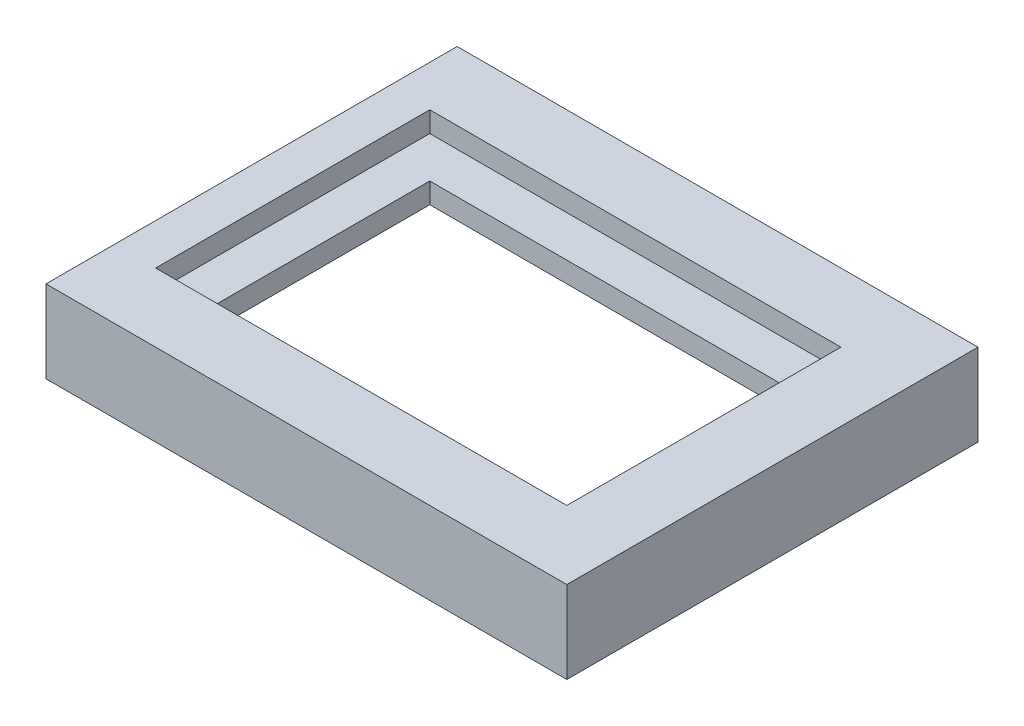
ISO-10303-21;
HEADER;
FILE_DESCRIPTION(('STEP AP214'),'2;1');
FILE_NAME('part.step','',(''),(''),'','','');
FILE_SCHEMA(('AUTOMOTIVE_DESIGN { 1 0 10303 214 1 1 1 1 }'));
ENDSEC;
DATA;
#1=APPLICATION_CONTEXT('core data for automotive mechanical design processes');
#2=APPLICATION_PROTOCOL_DEFINITION('international standard','automotive_design',2000,#1);
#3=PRODUCT_CONTEXT('',#1,'mechanical');
#4=PRODUCT('Part','Part','',(#3));
#5=PRODUCT_RELATED_PRODUCT_CATEGORY('part','',(#4));
#6=PRODUCT_DEFINITION_FORMATION('','',#4);
#7=PRODUCT_DEFINITION_CONTEXT('part definition',#1,'design');
#8=PRODUCT_DEFINITION('design','',#6,#7);
#9=PRODUCT_DEFINITION_SHAPE('','',#8);
#10=(LENGTH_UNIT() NAMED_UNIT(*) SI_UNIT(.MILLI.,.METRE.));
#11=(NAMED_UNIT(*) PLANE_ANGLE_UNIT() SI_UNIT($,.RADIAN.));
#12=(NAMED_UNIT(*) SI_UNIT($,.STERADIAN.) SOLID_ANGLE_UNIT());
#13=UNCERTAINTY_MEASURE_WITH_UNIT(LENGTH_MEASURE(1.E-05),#10,'distance_accuracy_value','');
#14=(GEOMETRIC_REPRESENTATION_CONTEXT(3) GLOBAL_UNCERTAINTY_ASSIGNED_CONTEXT((#13)) GLOBAL_UNIT_ASSIGNED_CONTEXT((#10,
#11,#12)) REPRESENTATION_CONTEXT('',''));
#15=CARTESIAN_POINT('',(0.,0.,0.));
#16=DIRECTION('',(0.,0.,1.));
#17=DIRECTION('',(1.,0.,0.));
#18=AXIS2_PLACEMENT_3D('',#15,#16,#17);
#19=CARTESIAN_POINT('',(0.,3.,0.));
#20=DIRECTION('',(0.,-1.,0.));
#21=DIRECTION('',(0.,0.,-1.));
#22=AXIS2_PLACEMENT_3D('',#19,#20,#21);
#23=PLANE('',#22);
#24=DIRECTION('',(1.,0.,0.));
#25=VECTOR('',#24,1.);
#26=CARTESIAN_POINT('',(-9.99999999999999,3.,7.5));
#27=LINE('',#26,#25);
#28=CARTESIAN_POINT('',(-9.99999999999999,3.,7.5));
#29=VERTEX_POINT('',#28);
#30=CARTESIAN_POINT('',(9.00000000000001,3.,7.5));
#31=VERTEX_POINT('',#30);
#32=EDGE_CURVE('E172',#29,#31,#27,.T.);
#33=ORIENTED_EDGE('',*,*,#32,.T.);
#34=DIRECTION('',(0.,0.,1.));
#35=VECTOR('',#34,1.);
#36=CARTESIAN_POINT('',(9.00000000000001,3.,0.));
#37=LINE('',#36,#35);
#38=CARTESIAN_POINT('',(9.00000000000001,3.,-7.5));
#39=VERTEX_POINT('',#38);
#40=EDGE_CURVE('E158',#39,#31,#37,.T.);
#41=ORIENTED_EDGE('',*,*,#40,.F.);
#42=DIRECTION('',(1.,0.,0.));
#43=VECTOR('',#42,1.);
#44=CARTESIAN_POINT('',(-9.99999999999999,3.,-7.5));
#45=LINE('',#44,#43);
#46=CARTESIAN_POINT('',(-9.99999999999999,3.,-7.5));
#47=VERTEX_POINT('',#46);
#48=EDGE_CURVE('E169',#47,#39,#45,.T.);
#49=ORIENTED_EDGE('',*,*,#48,.F.);
#50=DIRECTION('',(0.,0.,-1.));
#51=VECTOR('',#50,1.);
#52=CARTESIAN_POINT('',(-9.99999999999999,3.,7.5));
#53=LINE('',#52,#51);
#54=EDGE_CURVE('E179',#29,#47,#53,.T.);
#55=ORIENTED_EDGE('',*,*,#54,.F.);
#56=EDGE_LOOP('',(#33,#41,#49,#55));
#57=FACE_BOUND('',#56,.T.);
#58=DIRECTION('',(1.,0.,0.));
#59=VECTOR('',#58,1.);
#60=CARTESIAN_POINT('',(0.,3.,-5.));
#61=LINE('',#60,#59);
#62=CARTESIAN_POINT('',(-8.49999999999999,3.,-5.));
#63=VERTEX_POINT('',#62);
#64=CARTESIAN_POINT('',(6.5,3.,-5.));
#65=VERTEX_POINT('',#64);
#66=EDGE_CURVE('E68',#63,#65,#61,.T.);
#67=ORIENTED_EDGE('',*,*,#66,.T.);
#68=DIRECTION('',(0.,0.,-1.));
#69=VECTOR('',#68,1.);
#70=CARTESIAN_POINT('',(6.5,3.,0.));
#71=LINE('',#70,#69);
#72=CARTESIAN_POINT('',(6.5,3.,5.));
#73=VERTEX_POINT('',#72);
#74=EDGE_CURVE('E229',#73,#65,#71,.T.);
#75=ORIENTED_EDGE('',*,*,#74,.F.);
#76=DIRECTION('',(1.,0.,0.));
#77=VECTOR('',#76,1.);
#78=CARTESIAN_POINT('',(0.,3.,5.));
#79=LINE('',#78,#77);
#80=CARTESIAN_POINT('',(-8.49999999999999,3.,5.));
#81=VERTEX_POINT('',#80);
#82=EDGE_CURVE('E381',#81,#73,#79,.T.);
#83=ORIENTED_EDGE('',*,*,#82,.F.);
#84=DIRECTION('',(0.,0.,-1.));
#85=VECTOR('',#84,1.);
#86=CARTESIAN_POINT('',(-8.49999999999999,3.,0.));
#87=LINE('',#86,#85);
#88=EDGE_CURVE('E375',#81,#63,#87,.T.);
#89=ORIENTED_EDGE('',*,*,#88,.T.);
#90=EDGE_LOOP('',(#67,#75,#83,#89));
#91=FACE_BOUND('',#90,.T.);
#92=ADVANCED_FACE('F45',(#57,#91),#23,.F.);
#93=CARTESIAN_POINT('',(0.,0.,0.));
#94=DIRECTION('',(0.,-1.,0.));
#95=DIRECTION('',(0.,0.,-1.));
#96=AXIS2_PLACEMENT_3D('',#93,#94,#95);
#97=PLANE('',#96);
#98=DIRECTION('',(0.,0.,-1.));
#99=VECTOR('',#98,1.);
#100=CARTESIAN_POINT('',(9.00000000000001,0.,0.));
#101=LINE('',#100,#99);
#102=CARTESIAN_POINT('',(9.00000000000001,0.,7.5));
#103=VERTEX_POINT('',#102);
#104=CARTESIAN_POINT('',(9.00000000000001,0.,-7.5));
#105=VERTEX_POINT('',#104);
#106=EDGE_CURVE('E60',#103,#105,#101,.T.);
#107=ORIENTED_EDGE('',*,*,#106,.F.);
#108=DIRECTION('',(1.,0.,0.));
#109=VECTOR('',#108,1.);
#110=CARTESIAN_POINT('',(-9.99999999999999,0.,7.5));
#111=LINE('',#110,#109);
#112=CARTESIAN_POINT('',(-9.99999999999999,0.,7.5));
#113=VERTEX_POINT('',#112);
#114=EDGE_CURVE('E184',#113,#103,#111,.T.);
#115=ORIENTED_EDGE('',*,*,#114,.F.);
#116=DIRECTION('',(0.,0.,-1.));
#117=VECTOR('',#116,1.);
#118=CARTESIAN_POINT('',(-9.99999999999999,0.,7.5));
#119=LINE('',#118,#117);
#120=CARTESIAN_POINT('',(-9.99999999999999,0.,-7.5));
#121=VERTEX_POINT('',#120);
#122=EDGE_CURVE('E188',#113,#121,#119,.T.);
#123=ORIENTED_EDGE('',*,*,#122,.T.);
#124=DIRECTION('',(1.,0.,0.));
#125=VECTOR('',#124,1.);
#126=CARTESIAN_POINT('',(-9.99999999999999,0.,-7.5));
#127=LINE('',#126,#125);
#128=EDGE_CURVE('E192',#121,#105,#127,.T.);
#129=ORIENTED_EDGE('',*,*,#128,.T.);
#130=EDGE_LOOP('',(#107,#115,#123,#129));
#131=FACE_BOUND('',#130,.T.);
#132=DIRECTION('',(0.,0.,1.));
#133=VECTOR('',#132,1.);
#134=CARTESIAN_POINT('',(6.5,0.,0.));
#135=LINE('',#134,#133);
#136=CARTESIAN_POINT('',(6.5,0.,-5.));
#137=VERTEX_POINT('',#136);
#138=CARTESIAN_POINT('',(6.5,0.,5.));
#139=VERTEX_POINT('',#138);
#140=EDGE_CURVE('E270',#137,#139,#135,.T.);
#141=ORIENTED_EDGE('',*,*,#140,.F.);
#142=DIRECTION('',(-1.,0.,0.));
#143=VECTOR('',#142,1.);
#144=CARTESIAN_POINT('',(0.,0.,-5.));
#145=LINE('',#144,#143);
#146=CARTESIAN_POINT('',(-8.49999999999999,0.,-5.));
#147=VERTEX_POINT('',#146);
#148=EDGE_CURVE('E277',#137,#147,#145,.T.);
#149=ORIENTED_EDGE('',*,*,#148,.T.);
#150=DIRECTION('',(0.,0.,1.));
#151=VECTOR('',#150,1.);
#152=CARTESIAN_POINT('',(-8.49999999999999,0.,0.));
#153=LINE('',#152,#151);
#154=CARTESIAN_POINT('',(-8.49999999999999,0.,5.));
#155=VERTEX_POINT('',#154);
#156=EDGE_CURVE('E254',#147,#155,#153,.T.);
#157=ORIENTED_EDGE('',*,*,#156,.T.);
#158=DIRECTION('',(-1.,0.,0.));
#159=VECTOR('',#158,1.);
#160=CARTESIAN_POINT('',(0.,0.,5.));
#161=LINE('',#160,#159);
#162=EDGE_CURVE('E262',#139,#155,#161,.T.);
#163=ORIENTED_EDGE('',*,*,#162,.F.);
#164=EDGE_LOOP('',(#141,#149,#157,#163));
#165=FACE_BOUND('',#164,.T.);
#166=ADVANCED_FACE('F354',(#131,#165),#97,.T.);
#167=CARTESIAN_POINT('',(8.,0.75,-6.50000000000001));
#168=DIRECTION('',(0.,-1.,0.));
#169=DIRECTION('',(0.,0.,-1.));
#170=AXIS2_PLACEMENT_3D('',#167,#168,#169);
#171=PLANE('',#170);
#172=DIRECTION('',(0.,0.,1.));
#173=VECTOR('',#172,1.);
#174=CARTESIAN_POINT('',(-9.99999999999999,0.75,-6.50000000000001));
#175=LINE('',#174,#173);
#176=CARTESIAN_POINT('',(-9.99999999999999,0.75,-6.50000000000001));
#177=VERTEX_POINT('',#176);
#178=CARTESIAN_POINT('',(-9.99999999999999,0.75,6.49999999999999));
#179=VERTEX_POINT('',#178);
#180=EDGE_CURVE('E281',#177,#179,#175,.T.);
#181=ORIENTED_EDGE('',*,*,#180,.T.);
#182=DIRECTION('',(-1.,0.,0.));
#183=VECTOR('',#182,1.);
#184=CARTESIAN_POINT('',(8.,0.75,6.49999999999999));
#185=LINE('',#184,#183);
#186=CARTESIAN_POINT('',(8.,0.75,6.49999999999999));
#187=VERTEX_POINT('',#186);
#188=EDGE_CURVE('E297',#187,#179,#185,.T.);
#189=ORIENTED_EDGE('',*,*,#188,.F.);
#190=DIRECTION('',(0.,0.,1.));
#191=VECTOR('',#190,1.);
#192=CARTESIAN_POINT('',(8.,0.75,-6.50000000000001));
#193=LINE('',#192,#191);
#194=CARTESIAN_POINT('',(8.,0.75,-6.50000000000001));
#195=VERTEX_POINT('',#194);
#196=EDGE_CURVE('E282',#195,#187,#193,.T.);
#197=ORIENTED_EDGE('',*,*,#196,.F.);
#198=DIRECTION('',(-1.,0.,0.));
#199=VECTOR('',#198,1.);
#200=CARTESIAN_POINT('',(8.,0.75,-6.50000000000001));
#201=LINE('',#200,#199);
#202=EDGE_CURVE('E193',#195,#177,#201,.T.);
#203=ORIENTED_EDGE('',*,*,#202,.T.);
#204=EDGE_LOOP('',(#181,#189,#197,#203));
#205=FACE_BOUND('',#204,.T.);
#206=DIRECTION('',(-1.,0.,0.));
#207=VECTOR('',#206,1.);
#208=CARTESIAN_POINT('',(8.,0.75,-5.));
#209=LINE('',#208,#207);
#210=CARTESIAN_POINT('',(6.5,0.750000000000001,-5.));
#211=VERTEX_POINT('',#210);
#212=CARTESIAN_POINT('',(-8.5,0.75,-5.));
#213=VERTEX_POINT('',#212);
#214=EDGE_CURVE('E273',#211,#213,#209,.T.);
#215=ORIENTED_EDGE('',*,*,#214,.F.);
#216=DIRECTION('',(0.,0.,1.));
#217=VECTOR('',#216,1.);
#218=CARTESIAN_POINT('',(6.5,0.75,-6.50000000000001));
#219=LINE('',#218,#217);
#220=CARTESIAN_POINT('',(6.5,0.750000000000001,5.));
#221=VERTEX_POINT('',#220);
#222=EDGE_CURVE('E266',#211,#221,#219,.T.);
#223=ORIENTED_EDGE('',*,*,#222,.T.);
#224=DIRECTION('',(-1.,0.,0.));
#225=VECTOR('',#224,1.);
#226=CARTESIAN_POINT('',(8.,0.75,5.));
#227=LINE('',#226,#225);
#228=CARTESIAN_POINT('',(-8.49999999999999,0.750000000000001,5.));
#229=VERTEX_POINT('',#228);
#230=EDGE_CURVE('E258',#221,#229,#227,.T.);
#231=ORIENTED_EDGE('',*,*,#230,.T.);
#232=DIRECTION('',(0.,0.,1.));
#233=VECTOR('',#232,1.);
#234=CARTESIAN_POINT('',(-8.5,0.75,-6.50000000000001));
#235=LINE('',#234,#233);
#236=EDGE_CURVE('E237',#213,#229,#235,.T.);
#237=ORIENTED_EDGE('',*,*,#236,.F.);
#238=EDGE_LOOP('',(#215,#223,#231,#237));
#239=FACE_BOUND('',#238,.T.);
#240=ADVANCED_FACE('F338',(#205,#239),#171,.F.);
#241=CARTESIAN_POINT('',(8.,2.25,-6.50000000000001));
#242=DIRECTION('',(0.,-1.,0.));
#243=DIRECTION('',(0.,0.,-1.));
#244=AXIS2_PLACEMENT_3D('',#241,#242,#243);
#245=PLANE('',#244);
#246=DIRECTION('',(0.,0.,1.));
#247=VECTOR('',#246,1.);
#248=CARTESIAN_POINT('',(-9.99999999999999,2.25,-6.50000000000001));
#249=LINE('',#248,#247);
#250=CARTESIAN_POINT('',(-9.99999999999999,2.25,-6.50000000000001));
#251=VERTEX_POINT('',#250);
#252=CARTESIAN_POINT('',(-9.99999999999999,2.25,6.49999999999999));
#253=VERTEX_POINT('',#252);
#254=EDGE_CURVE('E304',#251,#253,#249,.T.);
#255=ORIENTED_EDGE('',*,*,#254,.F.);
#256=DIRECTION('',(-1.,0.,0.));
#257=VECTOR('',#256,1.);
#258=CARTESIAN_POINT('',(8.,2.25,-6.50000000000001));
#259=LINE('',#258,#257);
#260=CARTESIAN_POINT('',(8.,2.25,-6.50000000000001));
#261=VERTEX_POINT('',#260);
#262=EDGE_CURVE('E313',#261,#251,#259,.T.);
#263=ORIENTED_EDGE('',*,*,#262,.F.);
#264=DIRECTION('',(0.,0.,1.));
#265=VECTOR('',#264,1.);
#266=CARTESIAN_POINT('',(8.,2.25,-6.50000000000001));
#267=LINE('',#266,#265);
#268=CARTESIAN_POINT('',(8.,2.25,6.49999999999999));
#269=VERTEX_POINT('',#268);
#270=EDGE_CURVE('E291',#261,#269,#267,.T.);
#271=ORIENTED_EDGE('',*,*,#270,.T.);
#272=DIRECTION('',(-1.,0.,0.));
#273=VECTOR('',#272,1.);
#274=CARTESIAN_POINT('',(8.,2.25,6.49999999999999));
#275=LINE('',#274,#273);
#276=EDGE_CURVE('E316',#269,#253,#275,.T.);
#277=ORIENTED_EDGE('',*,*,#276,.T.);
#278=EDGE_LOOP('',(#255,#263,#271,#277));
#279=FACE_BOUND('',#278,.T.);
#280=DIRECTION('',(0.,0.,1.));
#281=VECTOR('',#280,1.);
#282=CARTESIAN_POINT('',(6.5,2.25,-6.50000000000001));
#283=LINE('',#282,#281);
#284=CARTESIAN_POINT('',(6.5,2.25,-5.));
#285=VERTEX_POINT('',#284);
#286=CARTESIAN_POINT('',(6.5,2.25,5.));
#287=VERTEX_POINT('',#286);
#288=EDGE_CURVE('E212',#285,#287,#283,.T.);
#289=ORIENTED_EDGE('',*,*,#288,.F.);
#290=DIRECTION('',(-1.,0.,0.));
#291=VECTOR('',#290,1.);
#292=CARTESIAN_POINT('',(8.,2.25,-5.));
#293=LINE('',#292,#291);
#294=CARTESIAN_POINT('',(-8.49999999999999,2.25,-5.));
#295=VERTEX_POINT('',#294);
#296=EDGE_CURVE('E54',#285,#295,#293,.T.);
#297=ORIENTED_EDGE('',*,*,#296,.T.);
#298=DIRECTION('',(0.,0.,1.));
#299=VECTOR('',#298,1.);
#300=CARTESIAN_POINT('',(-8.5,2.25,-6.50000000000001));
#301=LINE('',#300,#299);
#302=CARTESIAN_POINT('',(-8.5,2.25,5.));
#303=VERTEX_POINT('',#302);
#304=EDGE_CURVE('E202',#295,#303,#301,.T.);
#305=ORIENTED_EDGE('',*,*,#304,.T.);
#306=DIRECTION('',(-1.,0.,0.));
#307=VECTOR('',#306,1.);
#308=CARTESIAN_POINT('',(8.,2.25,5.));
#309=LINE('',#308,#307);
#310=EDGE_CURVE('E208',#287,#303,#309,.T.);
#311=ORIENTED_EDGE('',*,*,#310,.F.);
#312=EDGE_LOOP('',(#289,#297,#305,#311));
#313=FACE_BOUND('',#312,.T.);
#314=ADVANCED_FACE('F218',(#279,#313),#245,.T.);
#315=CARTESIAN_POINT('',(-9.99999999999999,3.,7.5));
#316=DIRECTION('',(-1.,0.,0.));
#317=DIRECTION('',(0.,0.,1.));
#318=AXIS2_PLACEMENT_3D('',#315,#316,#317);
#319=PLANE('',#318);
#320=ORIENTED_EDGE('',*,*,#180,.F.);
#321=DIRECTION('',(0.,1.,0.));
#322=VECTOR('',#321,1.);
#323=CARTESIAN_POINT('',(-9.99999999999999,0.75,-6.50000000000001));
#324=LINE('',#323,#322);
#325=EDGE_CURVE('E287',#177,#251,#324,.T.);
#326=ORIENTED_EDGE('',*,*,#325,.T.);
#327=ORIENTED_EDGE('',*,*,#254,.T.);
#328=DIRECTION('',(0.,1.,0.));
#329=VECTOR('',#328,1.);
#330=CARTESIAN_POINT('',(-9.99999999999999,0.75,6.49999999999999));
#331=LINE('',#330,#329);
#332=EDGE_CURVE('E300',#179,#253,#331,.T.);
#333=ORIENTED_EDGE('',*,*,#332,.F.);
#334=EDGE_LOOP('',(#320,#326,#327,#333));
#335=FACE_BOUND('',#334,.T.);
#336=ORIENTED_EDGE('',*,*,#122,.F.);
#337=DIRECTION('',(0.,-1.,0.));
#338=VECTOR('',#337,1.);
#339=CARTESIAN_POINT('',(-9.99999999999999,3.,7.5));
#340=LINE('',#339,#338);
#341=EDGE_CURVE('E199',#29,#113,#340,.T.);
#342=ORIENTED_EDGE('',*,*,#341,.F.);
#343=ORIENTED_EDGE('',*,*,#54,.T.);
#344=DIRECTION('',(0.,-1.,0.));
#345=VECTOR('',#344,1.);
#346=CARTESIAN_POINT('',(-9.99999999999999,3.,-7.5));
#347=LINE('',#346,#345);
#348=EDGE_CURVE('E177',#47,#121,#347,.T.);
#349=ORIENTED_EDGE('',*,*,#348,.T.);
#350=EDGE_LOOP('',(#336,#342,#343,#349));
#351=FACE_BOUND('',#350,.T.);
#352=ADVANCED_FACE('F47',(#335,#351),#319,.T.);
#353=CARTESIAN_POINT('',(-9.99999999999999,3.,7.5));
#354=DIRECTION('',(0.,0.,-1.));
#355=DIRECTION('',(-1.,0.,0.));
#356=AXIS2_PLACEMENT_3D('',#353,#354,#355);
#357=PLANE('',#356);
#358=ORIENTED_EDGE('',*,*,#114,.T.);
#359=DIRECTION('',(0.,1.,0.));
#360=VECTOR('',#359,1.);
#361=CARTESIAN_POINT('',(9.00000000000001,-15.,7.5));
#362=LINE('',#361,#360);
#363=EDGE_CURVE('E174',#103,#31,#362,.T.);
#364=ORIENTED_EDGE('',*,*,#363,.T.);
#365=ORIENTED_EDGE('',*,*,#32,.F.);
#366=ORIENTED_EDGE('',*,*,#341,.T.);
#367=EDGE_LOOP('',(#358,#364,#365,#366));
#368=FACE_BOUND('',#367,.T.);
#369=ADVANCED_FACE('F350',(#368),#357,.F.);
#370=CARTESIAN_POINT('',(-9.99999999999999,3.,-7.5));
#371=DIRECTION('',(0.,0.,-1.));
#372=DIRECTION('',(-1.,0.,0.));
#373=AXIS2_PLACEMENT_3D('',#370,#371,#372);
#374=PLANE('',#373);
#375=DIRECTION('',(0.,1.,0.));
#376=VECTOR('',#375,1.);
#377=CARTESIAN_POINT('',(9.00000000000001,3.,-7.5));
#378=LINE('',#377,#376);
#379=EDGE_CURVE('E11',#105,#39,#378,.T.);
#380=ORIENTED_EDGE('',*,*,#379,.F.);
#381=ORIENTED_EDGE('',*,*,#128,.F.);
#382=ORIENTED_EDGE('',*,*,#348,.F.);
#383=ORIENTED_EDGE('',*,*,#48,.T.);
#384=EDGE_LOOP('',(#380,#381,#382,#383));
#385=FACE_BOUND('',#384,.T.);
#386=ADVANCED_FACE('F176',(#385),#374,.T.);
#387=CARTESIAN_POINT('',(8.,0.75,-6.50000000000001));
#388=DIRECTION('',(0.,0.,1.));
#389=DIRECTION('',(1.,0.,0.));
#390=AXIS2_PLACEMENT_3D('',#387,#388,#389);
#391=PLANE('',#390);
#392=ORIENTED_EDGE('',*,*,#325,.F.);
#393=ORIENTED_EDGE('',*,*,#202,.F.);
#394=DIRECTION('',(0.,1.,0.));
#395=VECTOR('',#394,1.);
#396=CARTESIAN_POINT('',(8.,0.75,-6.50000000000001));
#397=LINE('',#396,#395);
#398=EDGE_CURVE('E294',#195,#261,#397,.T.);
#399=ORIENTED_EDGE('',*,*,#398,.T.);
#400=ORIENTED_EDGE('',*,*,#262,.T.);
#401=EDGE_LOOP('',(#392,#393,#399,#400));
#402=FACE_BOUND('',#401,.T.);
#403=ADVANCED_FACE('F341',(#402),#391,.T.);
#404=CARTESIAN_POINT('',(8.,0.75,6.49999999999999));
#405=DIRECTION('',(0.,0.,1.));
#406=DIRECTION('',(1.,0.,0.));
#407=AXIS2_PLACEMENT_3D('',#404,#405,#406);
#408=PLANE('',#407);
#409=ORIENTED_EDGE('',*,*,#332,.T.);
#410=ORIENTED_EDGE('',*,*,#276,.F.);
#411=DIRECTION('',(0.,1.,0.));
#412=VECTOR('',#411,1.);
#413=CARTESIAN_POINT('',(8.,0.75,6.49999999999999));
#414=LINE('',#413,#412);
#415=EDGE_CURVE('E286',#187,#269,#414,.T.);
#416=ORIENTED_EDGE('',*,*,#415,.F.);
#417=ORIENTED_EDGE('',*,*,#188,.T.);
#418=EDGE_LOOP('',(#409,#410,#416,#417));
#419=FACE_BOUND('',#418,.T.);
#420=ADVANCED_FACE('F323',(#419),#408,.F.);
#421=CARTESIAN_POINT('',(8.,0.,0.));
#422=DIRECTION('',(-1.,0.,0.));
#423=DIRECTION('',(0.,0.,1.));
#424=AXIS2_PLACEMENT_3D('',#421,#422,#423);
#425=PLANE('',#424);
#426=ORIENTED_EDGE('',*,*,#196,.T.);
#427=ORIENTED_EDGE('',*,*,#415,.T.);
#428=ORIENTED_EDGE('',*,*,#270,.F.);
#429=ORIENTED_EDGE('',*,*,#398,.F.);
#430=EDGE_LOOP('',(#426,#427,#428,#429));
#431=FACE_BOUND('',#430,.T.);
#432=ADVANCED_FACE('F336',(#431),#425,.T.);
#433=CARTESIAN_POINT('',(-8.49999999999999,-15.,0.));
#434=DIRECTION('',(1.,0.,0.));
#435=DIRECTION('',(0.,0.,-1.));
#436=AXIS2_PLACEMENT_3D('',#433,#434,#435);
#437=PLANE('',#436);
#438=DIRECTION('',(0.,1.,0.));
#439=VECTOR('',#438,1.);
#440=CARTESIAN_POINT('',(-8.49999999999999,-15.,-5.));
#441=LINE('',#440,#439);
#442=EDGE_CURVE('E224',#295,#63,#441,.T.);
#443=ORIENTED_EDGE('',*,*,#442,.T.);
#444=ORIENTED_EDGE('',*,*,#88,.F.);
#445=DIRECTION('',(0.,1.,0.));
#446=VECTOR('',#445,1.);
#447=CARTESIAN_POINT('',(-8.49999999999999,-15.,5.));
#448=LINE('',#447,#446);
#449=EDGE_CURVE('E246',#303,#81,#448,.T.);
#450=ORIENTED_EDGE('',*,*,#449,.F.);
#451=ORIENTED_EDGE('',*,*,#304,.F.);
#452=EDGE_LOOP('',(#443,#444,#450,#451));
#453=FACE_BOUND('',#452,.T.);
#454=ADVANCED_FACE('F406',(#453),#437,.T.);
#455=CARTESIAN_POINT('',(0.,-15.,5.));
#456=DIRECTION('',(0.,0.,1.));
#457=DIRECTION('',(1.,0.,0.));
#458=AXIS2_PLACEMENT_3D('',#455,#456,#457);
#459=PLANE('',#458);
#460=ORIENTED_EDGE('',*,*,#310,.T.);
#461=ORIENTED_EDGE('',*,*,#449,.T.);
#462=ORIENTED_EDGE('',*,*,#82,.T.);
#463=DIRECTION('',(0.,1.,0.));
#464=VECTOR('',#463,1.);
#465=CARTESIAN_POINT('',(6.5,-15.,5.));
#466=LINE('',#465,#464);
#467=EDGE_CURVE('E239',#287,#73,#466,.T.);
#468=ORIENTED_EDGE('',*,*,#467,.F.);
#469=EDGE_LOOP('',(#460,#461,#462,#468));
#470=FACE_BOUND('',#469,.T.);
#471=ADVANCED_FACE('F413',(#470),#459,.F.);
#472=CARTESIAN_POINT('',(6.5,-15.,0.));
#473=DIRECTION('',(1.,0.,0.));
#474=DIRECTION('',(0.,0.,-1.));
#475=AXIS2_PLACEMENT_3D('',#472,#473,#474);
#476=PLANE('',#475);
#477=ORIENTED_EDGE('',*,*,#288,.T.);
#478=ORIENTED_EDGE('',*,*,#467,.T.);
#479=ORIENTED_EDGE('',*,*,#74,.T.);
#480=DIRECTION('',(0.,1.,0.));
#481=VECTOR('',#480,1.);
#482=CARTESIAN_POINT('',(6.5,-15.,-5.));
#483=LINE('',#482,#481);
#484=EDGE_CURVE('E222',#285,#65,#483,.T.);
#485=ORIENTED_EDGE('',*,*,#484,.F.);
#486=EDGE_LOOP('',(#477,#478,#479,#485));
#487=FACE_BOUND('',#486,.T.);
#488=ADVANCED_FACE('F226',(#487),#476,.F.);
#489=CARTESIAN_POINT('',(0.,-15.,-5.));
#490=DIRECTION('',(0.,0.,1.));
#491=DIRECTION('',(1.,0.,0.));
#492=AXIS2_PLACEMENT_3D('',#489,#490,#491);
#493=PLANE('',#492);
#494=ORIENTED_EDGE('',*,*,#484,.T.);
#495=ORIENTED_EDGE('',*,*,#66,.F.);
#496=ORIENTED_EDGE('',*,*,#442,.F.);
#497=ORIENTED_EDGE('',*,*,#296,.F.);
#498=EDGE_LOOP('',(#494,#495,#496,#497));
#499=FACE_BOUND('',#498,.T.);
#500=ADVANCED_FACE('F221',(#499),#493,.T.);
#501=EDGE_CURVE('E231',#137,#211,#483,.T.);
#502=ORIENTED_EDGE('',*,*,#501,.T.);
#503=ORIENTED_EDGE('',*,*,#214,.T.);
#504=EDGE_CURVE('E249',#147,#213,#441,.T.);
#505=ORIENTED_EDGE('',*,*,#504,.F.);
#506=ORIENTED_EDGE('',*,*,#148,.F.);
#507=EDGE_LOOP('',(#502,#503,#505,#506));
#508=FACE_BOUND('',#507,.T.);
#509=ADVANCED_FACE('F402',(#508),#493,.T.);
#510=ORIENTED_EDGE('',*,*,#140,.T.);
#511=EDGE_CURVE('E232',#139,#221,#466,.T.);
#512=ORIENTED_EDGE('',*,*,#511,.T.);
#513=ORIENTED_EDGE('',*,*,#222,.F.);
#514=ORIENTED_EDGE('',*,*,#501,.F.);
#515=EDGE_LOOP('',(#510,#512,#513,#514));
#516=FACE_BOUND('',#515,.T.);
#517=ADVANCED_FACE('F399',(#516),#476,.F.);
#518=ORIENTED_EDGE('',*,*,#162,.T.);
#519=EDGE_CURVE('E245',#155,#229,#448,.T.);
#520=ORIENTED_EDGE('',*,*,#519,.T.);
#521=ORIENTED_EDGE('',*,*,#230,.F.);
#522=ORIENTED_EDGE('',*,*,#511,.F.);
#523=EDGE_LOOP('',(#518,#520,#521,#522));
#524=FACE_BOUND('',#523,.T.);
#525=ADVANCED_FACE('F391',(#524),#459,.F.);
#526=ORIENTED_EDGE('',*,*,#504,.T.);
#527=ORIENTED_EDGE('',*,*,#236,.T.);
#528=ORIENTED_EDGE('',*,*,#519,.F.);
#529=ORIENTED_EDGE('',*,*,#156,.F.);
#530=EDGE_LOOP('',(#526,#527,#528,#529));
#531=FACE_BOUND('',#530,.T.);
#532=ADVANCED_FACE('F404',(#531),#437,.T.);
#533=CARTESIAN_POINT('',(9.00000000000001,-15.,0.));
#534=DIRECTION('',(-1.,0.,0.));
#535=DIRECTION('',(0.,0.,1.));
#536=AXIS2_PLACEMENT_3D('',#533,#534,#535);
#537=PLANE('',#536);
#538=ORIENTED_EDGE('',*,*,#106,.T.);
#539=ORIENTED_EDGE('',*,*,#379,.T.);
#540=ORIENTED_EDGE('',*,*,#40,.T.);
#541=ORIENTED_EDGE('',*,*,#363,.F.);
#542=EDGE_LOOP('',(#538,#539,#540,#541));
#543=FACE_BOUND('',#542,.T.);
#544=ADVANCED_FACE('F157',(#543),#537,.F.);
#545=CLOSED_SHELL('',(#92,#166,#240,#314,#352,#369,#386,#403,#420,#432,#454,#471,#488,#500,#509,
#517,#525,#532,#544));
#546=MANIFOLD_SOLID_BREP('B2',#545);
#547=ADVANCED_BREP_SHAPE_REPRESENTATION('',(#18,#546),#14);
#548=SHAPE_DEFINITION_REPRESENTATION(#9,#547);
ENDSEC;
END-ISO-10303-21;
